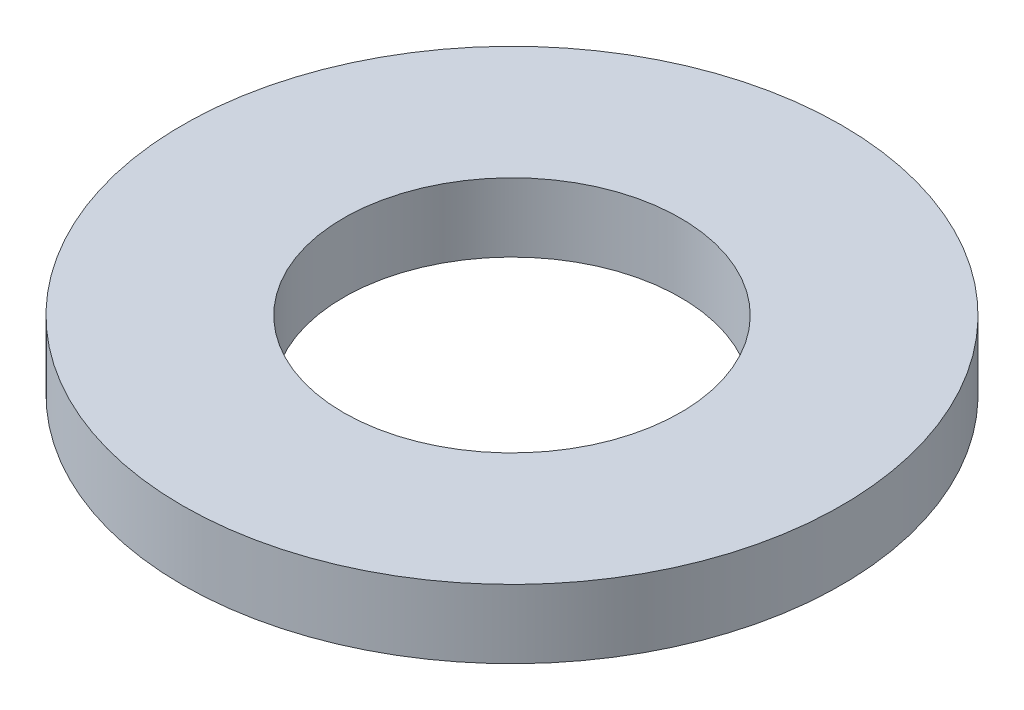
ISO-10303-21;
HEADER;
FILE_DESCRIPTION(('STEP AP214'),'2;1');
FILE_NAME('part.step','',(''),(''),'','','');
FILE_SCHEMA(('AUTOMOTIVE_DESIGN { 1 0 10303 214 1 1 1 1 }'));
ENDSEC;
DATA;
#1=APPLICATION_CONTEXT('core data for automotive mechanical design processes');
#2=APPLICATION_PROTOCOL_DEFINITION('international standard','automotive_design',2000,#1);
#3=PRODUCT_CONTEXT('',#1,'mechanical');
#4=PRODUCT('Part','Part','',(#3));
#5=PRODUCT_RELATED_PRODUCT_CATEGORY('part','',(#4));
#6=PRODUCT_DEFINITION_FORMATION('','',#4);
#7=PRODUCT_DEFINITION_CONTEXT('part definition',#1,'design');
#8=PRODUCT_DEFINITION('design','',#6,#7);
#9=PRODUCT_DEFINITION_SHAPE('','',#8);
#10=(LENGTH_UNIT() NAMED_UNIT(*) SI_UNIT(.MILLI.,.METRE.));
#11=(NAMED_UNIT(*) PLANE_ANGLE_UNIT() SI_UNIT($,.RADIAN.));
#12=(NAMED_UNIT(*) SI_UNIT($,.STERADIAN.) SOLID_ANGLE_UNIT());
#13=UNCERTAINTY_MEASURE_WITH_UNIT(LENGTH_MEASURE(1.E-05),#10,'distance_accuracy_value','');
#14=(GEOMETRIC_REPRESENTATION_CONTEXT(3) GLOBAL_UNCERTAINTY_ASSIGNED_CONTEXT((#13)) GLOBAL_UNIT_ASSIGNED_CONTEXT((#10,
#11,#12)) REPRESENTATION_CONTEXT('',''));
#15=CARTESIAN_POINT('',(0.,0.,0.));
#16=DIRECTION('',(0.,0.,1.));
#17=DIRECTION('',(1.,0.,0.));
#18=AXIS2_PLACEMENT_3D('',#15,#16,#17);
#19=CARTESIAN_POINT('',(0.,2.5,0.));
#20=DIRECTION('',(0.,1.,0.));
#21=DIRECTION('',(0.,0.,1.));
#22=AXIS2_PLACEMENT_3D('',#19,#20,#21);
#23=PLANE('',#22);
#24=CARTESIAN_POINT('',(0.,2.5,0.));
#25=DIRECTION('',(0.,1.,0.));
#26=DIRECTION('',(0.,0.,1.));
#27=AXIS2_PLACEMENT_3D('',#24,#25,#26);
#28=CIRCLE('',#27,12.);
#29=CARTESIAN_POINT('',(0.,2.5,12.));
#30=VERTEX_POINT('',#29);
#31=EDGE_CURVE('E10',#30,#30,#28,.T.);
#32=ORIENTED_EDGE('',*,*,#31,.T.);
#33=EDGE_LOOP('',(#32));
#34=FACE_BOUND('',#33,.T.);
#35=CARTESIAN_POINT('',(0.,2.5,0.));
#36=DIRECTION('',(0.,1.,0.));
#37=DIRECTION('',(0.,0.,1.));
#38=AXIS2_PLACEMENT_3D('',#35,#36,#37);
#39=CIRCLE('',#38,6.135);
#40=CARTESIAN_POINT('',(0.,2.5,6.135));
#41=VERTEX_POINT('',#40);
#42=EDGE_CURVE('E56',#41,#41,#39,.T.);
#43=ORIENTED_EDGE('',*,*,#42,.F.);
#44=EDGE_LOOP('',(#43));
#45=FACE_BOUND('',#44,.T.);
#46=ADVANCED_FACE('F42',(#34,#45),#23,.T.);
#47=CARTESIAN_POINT('',(0.,0.,0.));
#48=DIRECTION('',(0.,1.,0.));
#49=DIRECTION('',(0.,0.,1.));
#50=AXIS2_PLACEMENT_3D('',#47,#48,#49);
#51=PLANE('',#50);
#52=CARTESIAN_POINT('',(0.,0.,0.));
#53=DIRECTION('',(0.,1.,0.));
#54=DIRECTION('',(0.,0.,1.));
#55=AXIS2_PLACEMENT_3D('',#52,#53,#54);
#56=CIRCLE('',#55,12.);
#57=CARTESIAN_POINT('',(0.,0.,12.));
#58=VERTEX_POINT('',#57);
#59=EDGE_CURVE('E46',#58,#58,#56,.T.);
#60=ORIENTED_EDGE('',*,*,#59,.F.);
#61=EDGE_LOOP('',(#60));
#62=FACE_BOUND('',#61,.T.);
#63=CARTESIAN_POINT('',(0.,0.,0.));
#64=DIRECTION('',(0.,1.,0.));
#65=DIRECTION('',(0.,0.,1.));
#66=AXIS2_PLACEMENT_3D('',#63,#64,#65);
#67=CIRCLE('',#66,6.135);
#68=CARTESIAN_POINT('',(0.,0.,6.135));
#69=VERTEX_POINT('',#68);
#70=EDGE_CURVE('E58',#69,#69,#67,.T.);
#71=ORIENTED_EDGE('',*,*,#70,.T.);
#72=EDGE_LOOP('',(#71));
#73=FACE_BOUND('',#72,.T.);
#74=ADVANCED_FACE('F71',(#62,#73),#51,.F.);
#75=CARTESIAN_POINT('',(0.,2.5,0.));
#76=DIRECTION('',(0.,-1.,0.));
#77=DIRECTION('',(0.,0.,-1.));
#78=AXIS2_PLACEMENT_3D('',#75,#76,#77);
#79=CYLINDRICAL_SURFACE('',#78,12.);
#80=ORIENTED_EDGE('',*,*,#31,.F.);
#81=EDGE_LOOP('',(#80));
#82=FACE_BOUND('',#81,.T.);
#83=ORIENTED_EDGE('',*,*,#59,.T.);
#84=EDGE_LOOP('',(#83));
#85=FACE_BOUND('',#84,.T.);
#86=ADVANCED_FACE('F44',(#82,#85),#79,.T.);
#87=CARTESIAN_POINT('',(0.,2.5,0.));
#88=DIRECTION('',(0.,-1.,0.));
#89=DIRECTION('',(0.,0.,-1.));
#90=AXIS2_PLACEMENT_3D('',#87,#88,#89);
#91=CYLINDRICAL_SURFACE('',#90,6.135);
#92=ORIENTED_EDGE('',*,*,#42,.T.);
#93=EDGE_LOOP('',(#92));
#94=FACE_BOUND('',#93,.T.);
#95=ORIENTED_EDGE('',*,*,#70,.F.);
#96=EDGE_LOOP('',(#95));
#97=FACE_BOUND('',#96,.T.);
#98=ADVANCED_FACE('F67',(#94,#97),#91,.F.);
#99=CLOSED_SHELL('',(#46,#74,#86,#98));
#100=MANIFOLD_SOLID_BREP('B2',#99);
#101=ADVANCED_BREP_SHAPE_REPRESENTATION('',(#18,#100),#14);
#102=SHAPE_DEFINITION_REPRESENTATION(#9,#101);
ENDSEC;
END-ISO-10303-21;
